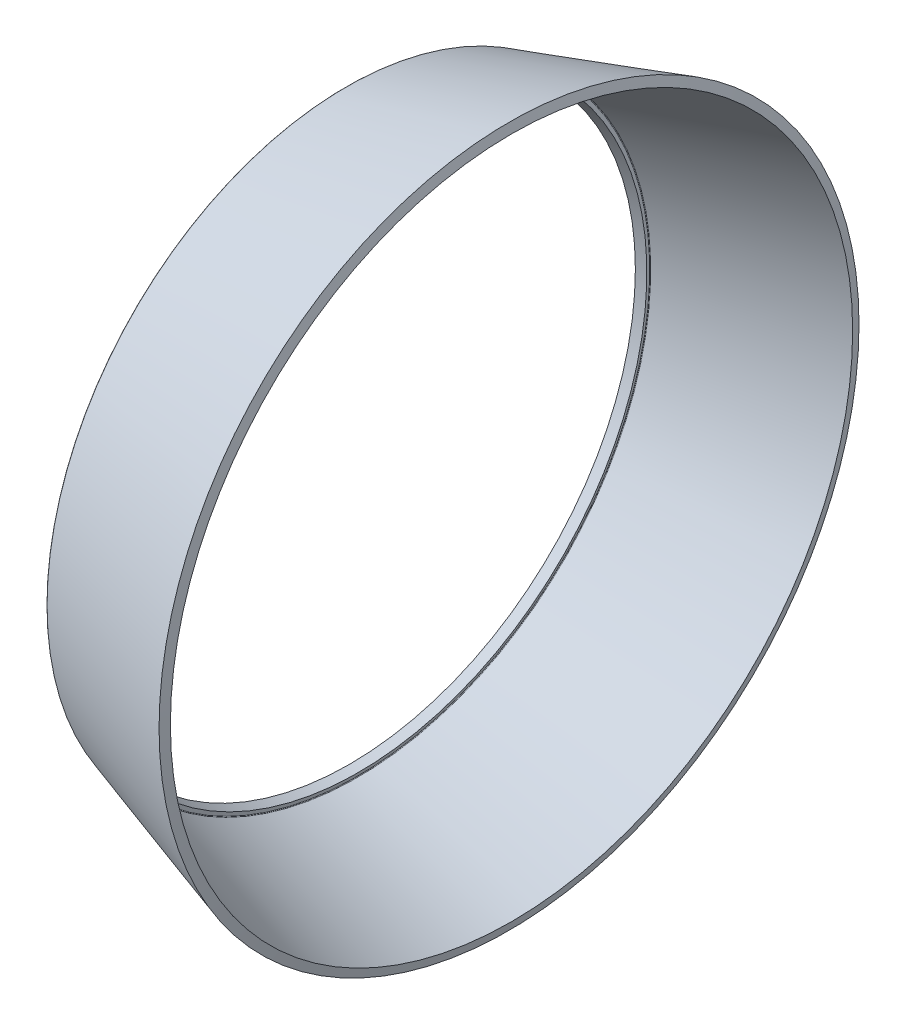
ISO-10303-21;
HEADER;
FILE_DESCRIPTION(('STEP AP214'),'2;1');
FILE_NAME('part.step','',(''),(''),'','','');
FILE_SCHEMA(('AUTOMOTIVE_DESIGN { 1 0 10303 214 1 1 1 1 }'));
ENDSEC;
DATA;
#1=APPLICATION_CONTEXT('core data for automotive mechanical design processes');
#2=APPLICATION_PROTOCOL_DEFINITION('international standard','automotive_design',2000,#1);
#3=PRODUCT_CONTEXT('',#1,'mechanical');
#4=PRODUCT('Part','Part','',(#3));
#5=PRODUCT_RELATED_PRODUCT_CATEGORY('part','',(#4));
#6=PRODUCT_DEFINITION_FORMATION('','',#4);
#7=PRODUCT_DEFINITION_CONTEXT('part definition',#1,'design');
#8=PRODUCT_DEFINITION('design','',#6,#7);
#9=PRODUCT_DEFINITION_SHAPE('','',#8);
#10=(LENGTH_UNIT() NAMED_UNIT(*) SI_UNIT(.MILLI.,.METRE.));
#11=(NAMED_UNIT(*) PLANE_ANGLE_UNIT() SI_UNIT($,.RADIAN.));
#12=(NAMED_UNIT(*) SI_UNIT($,.STERADIAN.) SOLID_ANGLE_UNIT());
#13=UNCERTAINTY_MEASURE_WITH_UNIT(LENGTH_MEASURE(1.E-05),#10,'distance_accuracy_value','');
#14=(GEOMETRIC_REPRESENTATION_CONTEXT(3) GLOBAL_UNCERTAINTY_ASSIGNED_CONTEXT((#13)) GLOBAL_UNIT_ASSIGNED_CONTEXT((#10,
#11,#12)) REPRESENTATION_CONTEXT('',''));
#15=CARTESIAN_POINT('',(0.,0.,0.));
#16=DIRECTION('',(0.,0.,1.));
#17=DIRECTION('',(1.,0.,0.));
#18=AXIS2_PLACEMENT_3D('',#15,#16,#17);
#19=CARTESIAN_POINT('',(16.47834454855,0.,0.));
#20=DIRECTION('',(1.,0.,0.));
#21=DIRECTION('',(0.,1.92324501109706E-10,1.));
#22=AXIS2_PLACEMENT_3D('',#19,#20,#21);
#23=CONICAL_SURFACE('',#22,38.076035082764,0.30165398126848);
#24=CARTESIAN_POINT('',(-1.19519891506538,0.,0.));
#25=DIRECTION('',(1.,0.,0.));
#26=DIRECTION('',(0.,0.,1.));
#27=AXIS2_PLACEMENT_3D('',#24,#25,#26);
#28=CIRCLE('',#27,32.576922145218);
#29=CARTESIAN_POINT('',(-1.19519891506538,0.,32.576922145218));
#30=VERTEX_POINT('',#29);
#31=EDGE_CURVE('E43',#30,#30,#28,.T.);
#32=ORIENTED_EDGE('',*,*,#31,.T.);
#33=EDGE_LOOP('',(#32));
#34=FACE_BOUND('',#33,.T.);
#35=CARTESIAN_POINT('',(16.47834454855,0.,0.));
#36=DIRECTION('',(-1.,0.,0.));
#37=DIRECTION('',(0.,0.,-1.));
#38=AXIS2_PLACEMENT_3D('',#35,#36,#37);
#39=CIRCLE('',#38,38.076035082764);
#40=CARTESIAN_POINT('',(16.47834454855,0.,-38.076035082764));
#41=VERTEX_POINT('',#40);
#42=EDGE_CURVE('E40',#41,#41,#39,.F.);
#43=ORIENTED_EDGE('',*,*,#42,.F.);
#44=EDGE_LOOP('',(#43));
#45=FACE_BOUND('',#44,.T.);
#46=ADVANCED_FACE('F14',(#34,#45),#23,.T.);
#47=CARTESIAN_POINT('',(-1.16548892402714,0.,0.));
#48=DIRECTION('',(1.,0.,0.));
#49=DIRECTION('',(0.,0.,1.));
#50=AXIS2_PLACEMENT_3D('',#47,#48,#49);
#51=TOROIDAL_SURFACE('',#50,32.481437505445,0.100000000000343);
#52=CARTESIAN_POINT('',(-1.26173444767301,0.,0.));
#53=DIRECTION('',(1.,0.,0.));
#54=DIRECTION('',(0.,0.,1.));
#55=AXIS2_PLACEMENT_3D('',#52,#53,#54);
#56=CIRCLE('',#55,32.454293460459);
#57=CARTESIAN_POINT('',(-1.26173444767301,0.,32.454293460459));
#58=VERTEX_POINT('',#57);
#59=EDGE_CURVE('E37',#58,#58,#56,.T.);
#60=ORIENTED_EDGE('',*,*,#59,.T.);
#61=EDGE_LOOP('',(#60));
#62=FACE_BOUND('',#61,.T.);
#63=ORIENTED_EDGE('',*,*,#31,.F.);
#64=EDGE_LOOP('',(#63));
#65=FACE_BOUND('',#64,.T.);
#66=ADVANCED_FACE('F49',(#62,#65),#51,.T.);
#67=CARTESIAN_POINT('',(-1.26173444767301,0.,0.));
#68=DIRECTION('',(-1.,0.,0.));
#69=DIRECTION('',(0.,0.,-1.));
#70=AXIS2_PLACEMENT_3D('',#67,#68,#69);
#71=CONICAL_SURFACE('',#70,32.454293460459,1.29590696960583);
#72=ORIENTED_EDGE('',*,*,#59,.F.);
#73=EDGE_LOOP('',(#72));
#74=FACE_BOUND('',#73,.T.);
#75=CARTESIAN_POINT('',(-0.880854992013365,0.,0.));
#76=DIRECTION('',(1.,0.,0.));
#77=DIRECTION('',(0.,0.,1.));
#78=AXIS2_PLACEMENT_3D('',#75,#76,#77);
#79=CIRCLE('',#78,31.103796779734);
#80=CARTESIAN_POINT('',(-0.880854992013365,0.,31.103796779734));
#81=VERTEX_POINT('',#80);
#82=EDGE_CURVE('E34',#81,#81,#79,.T.);
#83=ORIENTED_EDGE('',*,*,#82,.T.);
#84=EDGE_LOOP('',(#83));
#85=FACE_BOUND('',#84,.T.);
#86=ADVANCED_FACE('F51',(#74,#85),#71,.F.);
#87=CARTESIAN_POINT('',(0.0743335075930632,0.,0.));
#88=DIRECTION('',(1.,0.,0.));
#89=DIRECTION('',(0.,0.,1.));
#90=AXIS2_PLACEMENT_3D('',#87,#88,#89);
#91=CONICAL_SURFACE('',#90,31.401003134917,0.301653981268949);
#92=CARTESIAN_POINT('',(0.0743335075930632,0.,0.));
#93=DIRECTION('',(1.,0.,0.));
#94=DIRECTION('',(0.,0.,1.));
#95=AXIS2_PLACEMENT_3D('',#92,#93,#94);
#96=CIRCLE('',#95,31.401003134917);
#97=CARTESIAN_POINT('',(0.0743335075930632,0.,31.401003134917));
#98=VERTEX_POINT('',#97);
#99=EDGE_CURVE('E29',#98,#98,#96,.T.);
#100=ORIENTED_EDGE('',*,*,#99,.T.);
#101=EDGE_LOOP('',(#100));
#102=FACE_BOUND('',#101,.T.);
#103=ORIENTED_EDGE('',*,*,#82,.F.);
#104=EDGE_LOOP('',(#103));
#105=FACE_BOUND('',#104,.T.);
#106=ADVANCED_FACE('F59',(#102,#105),#91,.F.);
#107=CARTESIAN_POINT('',(-0.0438172788080335,0.,0.));
#108=DIRECTION('',(-1.,0.,0.));
#109=DIRECTION('',(0.,0.,-1.));
#110=AXIS2_PLACEMENT_3D('',#107,#108,#109);
#111=CONICAL_SURFACE('',#110,31.819934223188,1.29590696960556);
#112=ORIENTED_EDGE('',*,*,#99,.F.);
#113=EDGE_LOOP('',(#112));
#114=FACE_BOUND('',#113,.T.);
#115=CARTESIAN_POINT('',(-0.0438172788080308,0.,0.));
#116=DIRECTION('',(1.,0.,0.));
#117=DIRECTION('',(0.,0.,1.));
#118=AXIS2_PLACEMENT_3D('',#115,#116,#117);
#119=CIRCLE('',#118,31.819934223188);
#120=CARTESIAN_POINT('',(-0.0438172788080308,0.,31.819934223188));
#121=VERTEX_POINT('',#120);
#122=EDGE_CURVE('E25',#121,#121,#119,.T.);
#123=ORIENTED_EDGE('',*,*,#122,.T.);
#124=EDGE_LOOP('',(#123));
#125=FACE_BOUND('',#124,.T.);
#126=ADVANCED_FACE('F66',(#114,#125),#111,.T.);
#127=CARTESIAN_POINT('',(0.0203464036209304,0.,0.));
#128=DIRECTION('',(1.,0.,0.));
#129=DIRECTION('',(0.,0.,1.));
#130=AXIS2_PLACEMENT_3D('',#127,#128,#129);
#131=TOROIDAL_SURFACE('',#130,31.8380302531796,0.0666666666655808);
#132=CARTESIAN_POINT('',(0.000539742930322003,0.,0.));
#133=DIRECTION('',(1.,0.,0.));
#134=DIRECTION('',(0.,0.,1.));
#135=AXIS2_PLACEMENT_3D('',#132,#133,#134);
#136=CIRCLE('',#135,31.901686679694);
#137=CARTESIAN_POINT('',(0.000539742930322003,0.,31.901686679694));
#138=VERTEX_POINT('',#137);
#139=EDGE_CURVE('E21',#138,#138,#136,.T.);
#140=ORIENTED_EDGE('',*,*,#139,.T.);
#141=EDGE_LOOP('',(#140));
#142=FACE_BOUND('',#141,.T.);
#143=ORIENTED_EDGE('',*,*,#122,.F.);
#144=EDGE_LOOP('',(#143));
#145=FACE_BOUND('',#144,.T.);
#146=ADVANCED_FACE('F70',(#142,#145),#131,.F.);
#147=CARTESIAN_POINT('',(16.749882249961,0.,0.));
#148=DIRECTION('',(1.,0.,0.));
#149=DIRECTION('',(0.,0.,1.));
#150=AXIS2_PLACEMENT_3D('',#147,#148,#149);
#151=CONICAL_SURFACE('',#150,37.11323501834,0.301653981268454);
#152=CARTESIAN_POINT('',(16.749882249961,0.,0.));
#153=DIRECTION('',(1.,0.,0.));
#154=DIRECTION('',(0.,0.,1.));
#155=AXIS2_PLACEMENT_3D('',#152,#153,#154);
#156=CIRCLE('',#155,37.11323501834);
#157=CARTESIAN_POINT('',(16.749882249961,0.,37.11323501834));
#158=VERTEX_POINT('',#157);
#159=EDGE_CURVE('E10',#158,#158,#156,.T.);
#160=ORIENTED_EDGE('',*,*,#159,.T.);
#161=EDGE_LOOP('',(#160));
#162=FACE_BOUND('',#161,.T.);
#163=ORIENTED_EDGE('',*,*,#139,.F.);
#164=EDGE_LOOP('',(#163));
#165=FACE_BOUND('',#164,.T.);
#166=ADVANCED_FACE('F73',(#162,#165),#151,.F.);
#167=CARTESIAN_POINT('',(16.47834454855,0.,0.));
#168=DIRECTION('',(-1.,0.,0.));
#169=DIRECTION('',(0.,0.,-1.));
#170=AXIS2_PLACEMENT_3D('',#167,#168,#169);
#171=CONICAL_SURFACE('',#170,38.076035082764,1.29590696960556);
#172=ORIENTED_EDGE('',*,*,#42,.T.);
#173=EDGE_LOOP('',(#172));
#174=FACE_BOUND('',#173,.T.);
#175=ORIENTED_EDGE('',*,*,#159,.F.);
#176=EDGE_LOOP('',(#175));
#177=FACE_BOUND('',#176,.T.);
#178=ADVANCED_FACE('F16',(#174,#177),#171,.T.);
#179=CLOSED_SHELL('',(#46,#66,#86,#106,#126,#146,#166,#178));
#180=MANIFOLD_SOLID_BREP('B1',#179);
#181=ADVANCED_BREP_SHAPE_REPRESENTATION('',(#18,#180),#14);
#182=SHAPE_DEFINITION_REPRESENTATION(#9,#181);
ENDSEC;
END-ISO-10303-21;
